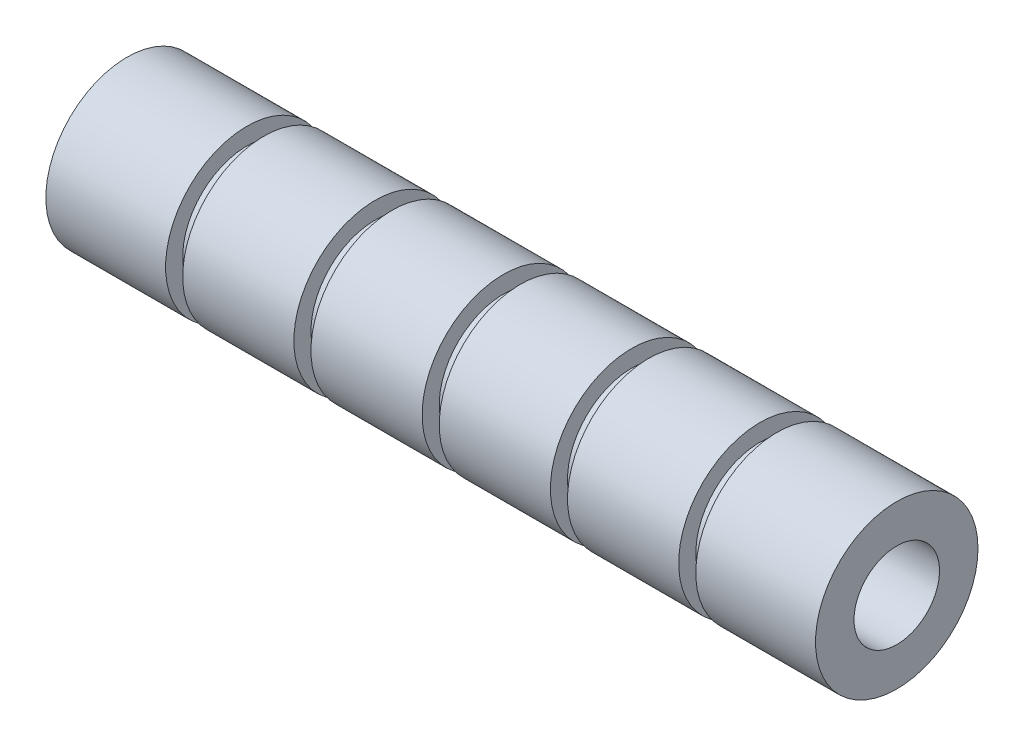
ISO-10303-21;
HEADER;
FILE_DESCRIPTION(('STEP AP214'),'2;1');
FILE_NAME('part.step','',(''),(''),'','','');
FILE_SCHEMA(('AUTOMOTIVE_DESIGN { 1 0 10303 214 1 1 1 1 }'));
ENDSEC;
DATA;
#1=APPLICATION_CONTEXT('core data for automotive mechanical design processes');
#2=APPLICATION_PROTOCOL_DEFINITION('international standard','automotive_design',2000,#1);
#3=PRODUCT_CONTEXT('',#1,'mechanical');
#4=PRODUCT('Part','Part','',(#3));
#5=PRODUCT_RELATED_PRODUCT_CATEGORY('part','',(#4));
#6=PRODUCT_DEFINITION_FORMATION('','',#4);
#7=PRODUCT_DEFINITION_CONTEXT('part definition',#1,'design');
#8=PRODUCT_DEFINITION('design','',#6,#7);
#9=PRODUCT_DEFINITION_SHAPE('','',#8);
#10=(LENGTH_UNIT() NAMED_UNIT(*) SI_UNIT(.MILLI.,.METRE.));
#11=(NAMED_UNIT(*) PLANE_ANGLE_UNIT() SI_UNIT($,.RADIAN.));
#12=(NAMED_UNIT(*) SI_UNIT($,.STERADIAN.) SOLID_ANGLE_UNIT());
#13=UNCERTAINTY_MEASURE_WITH_UNIT(LENGTH_MEASURE(1.E-05),#10,'distance_accuracy_value','');
#14=(GEOMETRIC_REPRESENTATION_CONTEXT(3) GLOBAL_UNCERTAINTY_ASSIGNED_CONTEXT((#13)) GLOBAL_UNIT_ASSIGNED_CONTEXT((#10,
#11,#12)) REPRESENTATION_CONTEXT('',''));
#15=CARTESIAN_POINT('',(0.,0.,0.));
#16=DIRECTION('',(0.,0.,1.));
#17=DIRECTION('',(1.,0.,0.));
#18=AXIS2_PLACEMENT_3D('',#15,#16,#17);
#19=CARTESIAN_POINT('',(0.999999999999998,0.,0.));
#20=DIRECTION('',(1.,0.,0.));
#21=DIRECTION('',(0.,0.,-1.));
#22=AXIS2_PLACEMENT_3D('',#19,#20,#21);
#23=CYLINDRICAL_SURFACE('',#22,7.5);
#24=CARTESIAN_POINT('',(-1.,0.,0.));
#25=DIRECTION('',(1.,0.,0.));
#26=DIRECTION('',(0.,0.,-1.));
#27=AXIS2_PLACEMENT_3D('',#24,#25,#26);
#28=CIRCLE('',#27,7.5);
#29=CARTESIAN_POINT('',(-1.,0.,-7.5));
#30=VERTEX_POINT('',#29);
#31=EDGE_CURVE('E131',#30,#30,#28,.T.);
#32=ORIENTED_EDGE('',*,*,#31,.T.);
#33=EDGE_LOOP('',(#32));
#34=FACE_BOUND('',#33,.T.);
#35=CARTESIAN_POINT('',(0.999999999999998,0.,0.));
#36=DIRECTION('',(1.,0.,0.));
#37=DIRECTION('',(0.,0.,-1.));
#38=AXIS2_PLACEMENT_3D('',#35,#36,#37);
#39=CIRCLE('',#38,7.5);
#40=CARTESIAN_POINT('',(0.999999999999998,0.,-7.5));
#41=VERTEX_POINT('',#40);
#42=EDGE_CURVE('E136',#41,#41,#39,.F.);
#43=ORIENTED_EDGE('',*,*,#42,.T.);
#44=EDGE_LOOP('',(#43));
#45=FACE_BOUND('',#44,.T.);
#46=ADVANCED_FACE('F15',(#34,#45),#23,.T.);
#47=CARTESIAN_POINT('',(0.999999999999998,0.,0.));
#48=DIRECTION('',(1.,0.,0.));
#49=DIRECTION('',(0.,0.,-1.));
#50=AXIS2_PLACEMENT_3D('',#47,#48,#49);
#51=PLANE('',#50);
#52=ORIENTED_EDGE('',*,*,#42,.F.);
#53=EDGE_LOOP('',(#52));
#54=FACE_BOUND('',#53,.T.);
#55=CARTESIAN_POINT('',(1.00000000000001,0.,0.));
#56=DIRECTION('',(1.,0.,0.));
#57=DIRECTION('',(0.,0.,-1.));
#58=AXIS2_PLACEMENT_3D('',#55,#56,#57);
#59=CIRCLE('',#58,9.5);
#60=CARTESIAN_POINT('',(1.00000000000001,0.,-9.49999999999999));
#61=VERTEX_POINT('',#60);
#62=EDGE_CURVE('E126',#61,#61,#59,.T.);
#63=ORIENTED_EDGE('',*,*,#62,.F.);
#64=EDGE_LOOP('',(#63));
#65=FACE_BOUND('',#64,.T.);
#66=ADVANCED_FACE('F142',(#54,#65),#51,.F.);
#67=CARTESIAN_POINT('',(-1.,0.,0.));
#68=DIRECTION('',(-1.,0.,0.));
#69=DIRECTION('',(0.,0.,1.));
#70=AXIS2_PLACEMENT_3D('',#67,#68,#69);
#71=PLANE('',#70);
#72=ORIENTED_EDGE('',*,*,#31,.F.);
#73=EDGE_LOOP('',(#72));
#74=FACE_BOUND('',#73,.T.);
#75=CARTESIAN_POINT('',(-0.999999999999994,0.,0.));
#76=DIRECTION('',(1.,0.,0.));
#77=DIRECTION('',(0.,0.,-1.));
#78=AXIS2_PLACEMENT_3D('',#75,#76,#77);
#79=CIRCLE('',#78,9.5);
#80=CARTESIAN_POINT('',(-0.999999999999994,0.,-9.49999999999999));
#81=VERTEX_POINT('',#80);
#82=EDGE_CURVE('E121',#81,#81,#79,.F.);
#83=ORIENTED_EDGE('',*,*,#82,.F.);
#84=EDGE_LOOP('',(#83));
#85=FACE_BOUND('',#84,.T.);
#86=ADVANCED_FACE('F145',(#74,#85),#71,.F.);
#87=CARTESIAN_POINT('',(-45.,0.,0.));
#88=DIRECTION('',(1.,0.,0.));
#89=DIRECTION('',(0.,0.,-1.));
#90=AXIS2_PLACEMENT_3D('',#87,#88,#89);
#91=CYLINDRICAL_SURFACE('',#90,9.5);
#92=ORIENTED_EDGE('',*,*,#62,.T.);
#93=EDGE_LOOP('',(#92));
#94=FACE_BOUND('',#93,.T.);
#95=CARTESIAN_POINT('',(14.,0.,0.));
#96=DIRECTION('',(1.,0.,0.));
#97=DIRECTION('',(0.,0.,-1.));
#98=AXIS2_PLACEMENT_3D('',#95,#96,#97);
#99=CIRCLE('',#98,9.5);
#100=CARTESIAN_POINT('',(14.,0.,-9.49999999999999));
#101=VERTEX_POINT('',#100);
#102=EDGE_CURVE('E116',#101,#101,#99,.F.);
#103=ORIENTED_EDGE('',*,*,#102,.T.);
#104=EDGE_LOOP('',(#103));
#105=FACE_BOUND('',#104,.T.);
#106=ADVANCED_FACE('F148',(#94,#105),#91,.T.);
#107=CARTESIAN_POINT('',(-45.,0.,0.));
#108=DIRECTION('',(1.,0.,0.));
#109=DIRECTION('',(0.,0.,-1.));
#110=AXIS2_PLACEMENT_3D('',#107,#108,#109);
#111=CYLINDRICAL_SURFACE('',#110,9.5);
#112=CARTESIAN_POINT('',(-14.,0.,0.));
#113=DIRECTION('',(1.,0.,0.));
#114=DIRECTION('',(0.,0.,-1.));
#115=AXIS2_PLACEMENT_3D('',#112,#113,#114);
#116=CIRCLE('',#115,9.5);
#117=CARTESIAN_POINT('',(-14.,0.,-9.49999999999999));
#118=VERTEX_POINT('',#117);
#119=EDGE_CURVE('E111',#118,#118,#116,.T.);
#120=ORIENTED_EDGE('',*,*,#119,.T.);
#121=EDGE_LOOP('',(#120));
#122=FACE_BOUND('',#121,.T.);
#123=ORIENTED_EDGE('',*,*,#82,.T.);
#124=EDGE_LOOP('',(#123));
#125=FACE_BOUND('',#124,.T.);
#126=ADVANCED_FACE('F151',(#122,#125),#111,.T.);
#127=CARTESIAN_POINT('',(14.,0.,0.));
#128=DIRECTION('',(-1.,0.,0.));
#129=DIRECTION('',(0.,0.,1.));
#130=AXIS2_PLACEMENT_3D('',#127,#128,#129);
#131=PLANE('',#130);
#132=CARTESIAN_POINT('',(14.,0.,0.));
#133=DIRECTION('',(1.,0.,0.));
#134=DIRECTION('',(0.,0.,-1.));
#135=AXIS2_PLACEMENT_3D('',#132,#133,#134);
#136=CIRCLE('',#135,7.5);
#137=CARTESIAN_POINT('',(14.,0.,-7.5));
#138=VERTEX_POINT('',#137);
#139=EDGE_CURVE('E106',#138,#138,#136,.T.);
#140=ORIENTED_EDGE('',*,*,#139,.F.);
#141=EDGE_LOOP('',(#140));
#142=FACE_BOUND('',#141,.T.);
#143=ORIENTED_EDGE('',*,*,#102,.F.);
#144=EDGE_LOOP('',(#143));
#145=FACE_BOUND('',#144,.T.);
#146=ADVANCED_FACE('F155',(#142,#145),#131,.F.);
#147=CARTESIAN_POINT('',(-14.,0.,0.));
#148=DIRECTION('',(1.,0.,0.));
#149=DIRECTION('',(0.,0.,-1.));
#150=AXIS2_PLACEMENT_3D('',#147,#148,#149);
#151=PLANE('',#150);
#152=CARTESIAN_POINT('',(-14.,0.,0.));
#153=DIRECTION('',(1.,0.,0.));
#154=DIRECTION('',(0.,0.,-1.));
#155=AXIS2_PLACEMENT_3D('',#152,#153,#154);
#156=CIRCLE('',#155,7.5);
#157=CARTESIAN_POINT('',(-14.,0.,-7.5));
#158=VERTEX_POINT('',#157);
#159=EDGE_CURVE('E101',#158,#158,#156,.F.);
#160=ORIENTED_EDGE('',*,*,#159,.F.);
#161=EDGE_LOOP('',(#160));
#162=FACE_BOUND('',#161,.T.);
#163=ORIENTED_EDGE('',*,*,#119,.F.);
#164=EDGE_LOOP('',(#163));
#165=FACE_BOUND('',#164,.T.);
#166=ADVANCED_FACE('F157',(#162,#165),#151,.F.);
#167=CARTESIAN_POINT('',(16.,0.,0.));
#168=DIRECTION('',(1.,0.,0.));
#169=DIRECTION('',(0.,0.,-1.));
#170=AXIS2_PLACEMENT_3D('',#167,#168,#169);
#171=CYLINDRICAL_SURFACE('',#170,7.5);
#172=ORIENTED_EDGE('',*,*,#139,.T.);
#173=EDGE_LOOP('',(#172));
#174=FACE_BOUND('',#173,.T.);
#175=CARTESIAN_POINT('',(16.,0.,0.));
#176=DIRECTION('',(1.,0.,0.));
#177=DIRECTION('',(0.,0.,-1.));
#178=AXIS2_PLACEMENT_3D('',#175,#176,#177);
#179=CIRCLE('',#178,7.5);
#180=CARTESIAN_POINT('',(16.,0.,-7.5));
#181=VERTEX_POINT('',#180);
#182=EDGE_CURVE('E96',#181,#181,#179,.F.);
#183=ORIENTED_EDGE('',*,*,#182,.T.);
#184=EDGE_LOOP('',(#183));
#185=FACE_BOUND('',#184,.T.);
#186=ADVANCED_FACE('F165',(#174,#185),#171,.T.);
#187=CARTESIAN_POINT('',(-14.,0.,0.));
#188=DIRECTION('',(1.,0.,0.));
#189=DIRECTION('',(0.,0.,-1.));
#190=AXIS2_PLACEMENT_3D('',#187,#188,#189);
#191=CYLINDRICAL_SURFACE('',#190,7.5);
#192=CARTESIAN_POINT('',(-16.,0.,0.));
#193=DIRECTION('',(1.,0.,0.));
#194=DIRECTION('',(0.,0.,-1.));
#195=AXIS2_PLACEMENT_3D('',#192,#193,#194);
#196=CIRCLE('',#195,7.5);
#197=CARTESIAN_POINT('',(-16.,0.,-7.5));
#198=VERTEX_POINT('',#197);
#199=EDGE_CURVE('E91',#198,#198,#196,.T.);
#200=ORIENTED_EDGE('',*,*,#199,.T.);
#201=EDGE_LOOP('',(#200));
#202=FACE_BOUND('',#201,.T.);
#203=ORIENTED_EDGE('',*,*,#159,.T.);
#204=EDGE_LOOP('',(#203));
#205=FACE_BOUND('',#204,.T.);
#206=ADVANCED_FACE('F233',(#202,#205),#191,.T.);
#207=CARTESIAN_POINT('',(16.,0.,0.));
#208=DIRECTION('',(1.,0.,0.));
#209=DIRECTION('',(0.,0.,-1.));
#210=AXIS2_PLACEMENT_3D('',#207,#208,#209);
#211=PLANE('',#210);
#212=ORIENTED_EDGE('',*,*,#182,.F.);
#213=EDGE_LOOP('',(#212));
#214=FACE_BOUND('',#213,.T.);
#215=CARTESIAN_POINT('',(16.,0.,0.));
#216=DIRECTION('',(1.,0.,0.));
#217=DIRECTION('',(0.,0.,-1.));
#218=AXIS2_PLACEMENT_3D('',#215,#216,#217);
#219=CIRCLE('',#218,9.5);
#220=CARTESIAN_POINT('',(16.,0.,-9.49999999999999));
#221=VERTEX_POINT('',#220);
#222=EDGE_CURVE('E86',#221,#221,#219,.T.);
#223=ORIENTED_EDGE('',*,*,#222,.F.);
#224=EDGE_LOOP('',(#223));
#225=FACE_BOUND('',#224,.T.);
#226=ADVANCED_FACE('F229',(#214,#225),#211,.F.);
#227=CARTESIAN_POINT('',(-16.,0.,0.));
#228=DIRECTION('',(-1.,0.,0.));
#229=DIRECTION('',(0.,0.,1.));
#230=AXIS2_PLACEMENT_3D('',#227,#228,#229);
#231=PLANE('',#230);
#232=ORIENTED_EDGE('',*,*,#199,.F.);
#233=EDGE_LOOP('',(#232));
#234=FACE_BOUND('',#233,.T.);
#235=CARTESIAN_POINT('',(-16.,0.,0.));
#236=DIRECTION('',(1.,0.,0.));
#237=DIRECTION('',(0.,0.,-1.));
#238=AXIS2_PLACEMENT_3D('',#235,#236,#237);
#239=CIRCLE('',#238,9.5);
#240=CARTESIAN_POINT('',(-16.,0.,-9.49999999999999));
#241=VERTEX_POINT('',#240);
#242=EDGE_CURVE('E81',#241,#241,#239,.F.);
#243=ORIENTED_EDGE('',*,*,#242,.F.);
#244=EDGE_LOOP('',(#243));
#245=FACE_BOUND('',#244,.T.);
#246=ADVANCED_FACE('F225',(#234,#245),#231,.F.);
#247=CARTESIAN_POINT('',(-45.,0.,0.));
#248=DIRECTION('',(1.,0.,0.));
#249=DIRECTION('',(0.,0.,-1.));
#250=AXIS2_PLACEMENT_3D('',#247,#248,#249);
#251=CYLINDRICAL_SURFACE('',#250,9.5);
#252=ORIENTED_EDGE('',*,*,#222,.T.);
#253=EDGE_LOOP('',(#252));
#254=FACE_BOUND('',#253,.T.);
#255=CARTESIAN_POINT('',(29.,0.,0.));
#256=DIRECTION('',(1.,0.,0.));
#257=DIRECTION('',(0.,0.,-1.));
#258=AXIS2_PLACEMENT_3D('',#255,#256,#257);
#259=CIRCLE('',#258,9.5);
#260=CARTESIAN_POINT('',(29.,0.,-9.49999999999999));
#261=VERTEX_POINT('',#260);
#262=EDGE_CURVE('E76',#261,#261,#259,.F.);
#263=ORIENTED_EDGE('',*,*,#262,.T.);
#264=EDGE_LOOP('',(#263));
#265=FACE_BOUND('',#264,.T.);
#266=ADVANCED_FACE('F221',(#254,#265),#251,.T.);
#267=CARTESIAN_POINT('',(-45.,0.,0.));
#268=DIRECTION('',(1.,0.,0.));
#269=DIRECTION('',(0.,0.,-1.));
#270=AXIS2_PLACEMENT_3D('',#267,#268,#269);
#271=CYLINDRICAL_SURFACE('',#270,9.5);
#272=CARTESIAN_POINT('',(-29.,0.,0.));
#273=DIRECTION('',(1.,0.,0.));
#274=DIRECTION('',(0.,0.,-1.));
#275=AXIS2_PLACEMENT_3D('',#272,#273,#274);
#276=CIRCLE('',#275,9.5);
#277=CARTESIAN_POINT('',(-29.,0.,-9.49999999999999));
#278=VERTEX_POINT('',#277);
#279=EDGE_CURVE('E71',#278,#278,#276,.T.);
#280=ORIENTED_EDGE('',*,*,#279,.T.);
#281=EDGE_LOOP('',(#280));
#282=FACE_BOUND('',#281,.T.);
#283=ORIENTED_EDGE('',*,*,#242,.T.);
#284=EDGE_LOOP('',(#283));
#285=FACE_BOUND('',#284,.T.);
#286=ADVANCED_FACE('F217',(#282,#285),#271,.T.);
#287=CARTESIAN_POINT('',(29.,0.,0.));
#288=DIRECTION('',(-1.,0.,0.));
#289=DIRECTION('',(0.,0.,1.));
#290=AXIS2_PLACEMENT_3D('',#287,#288,#289);
#291=PLANE('',#290);
#292=CARTESIAN_POINT('',(29.,0.,0.));
#293=DIRECTION('',(1.,0.,0.));
#294=DIRECTION('',(0.,0.,-1.));
#295=AXIS2_PLACEMENT_3D('',#292,#293,#294);
#296=CIRCLE('',#295,7.5);
#297=CARTESIAN_POINT('',(29.,0.,-7.5));
#298=VERTEX_POINT('',#297);
#299=EDGE_CURVE('E66',#298,#298,#296,.T.);
#300=ORIENTED_EDGE('',*,*,#299,.F.);
#301=EDGE_LOOP('',(#300));
#302=FACE_BOUND('',#301,.T.);
#303=ORIENTED_EDGE('',*,*,#262,.F.);
#304=EDGE_LOOP('',(#303));
#305=FACE_BOUND('',#304,.T.);
#306=ADVANCED_FACE('F213',(#302,#305),#291,.F.);
#307=CARTESIAN_POINT('',(-29.,0.,0.));
#308=DIRECTION('',(1.,0.,0.));
#309=DIRECTION('',(0.,0.,-1.));
#310=AXIS2_PLACEMENT_3D('',#307,#308,#309);
#311=PLANE('',#310);
#312=CARTESIAN_POINT('',(-29.,0.,0.));
#313=DIRECTION('',(1.,0.,0.));
#314=DIRECTION('',(0.,0.,-1.));
#315=AXIS2_PLACEMENT_3D('',#312,#313,#314);
#316=CIRCLE('',#315,7.5);
#317=CARTESIAN_POINT('',(-29.,0.,-7.5));
#318=VERTEX_POINT('',#317);
#319=EDGE_CURVE('E61',#318,#318,#316,.F.);
#320=ORIENTED_EDGE('',*,*,#319,.F.);
#321=EDGE_LOOP('',(#320));
#322=FACE_BOUND('',#321,.T.);
#323=ORIENTED_EDGE('',*,*,#279,.F.);
#324=EDGE_LOOP('',(#323));
#325=FACE_BOUND('',#324,.T.);
#326=ADVANCED_FACE('F209',(#322,#325),#311,.F.);
#327=CARTESIAN_POINT('',(31.,0.,0.));
#328=DIRECTION('',(1.,0.,0.));
#329=DIRECTION('',(0.,0.,-1.));
#330=AXIS2_PLACEMENT_3D('',#327,#328,#329);
#331=CYLINDRICAL_SURFACE('',#330,7.5);
#332=ORIENTED_EDGE('',*,*,#299,.T.);
#333=EDGE_LOOP('',(#332));
#334=FACE_BOUND('',#333,.T.);
#335=CARTESIAN_POINT('',(31.,0.,0.));
#336=DIRECTION('',(1.,0.,0.));
#337=DIRECTION('',(0.,0.,-1.));
#338=AXIS2_PLACEMENT_3D('',#335,#336,#337);
#339=CIRCLE('',#338,7.5);
#340=CARTESIAN_POINT('',(31.,0.,-7.5));
#341=VERTEX_POINT('',#340);
#342=EDGE_CURVE('E56',#341,#341,#339,.F.);
#343=ORIENTED_EDGE('',*,*,#342,.T.);
#344=EDGE_LOOP('',(#343));
#345=FACE_BOUND('',#344,.T.);
#346=ADVANCED_FACE('F205',(#334,#345),#331,.T.);
#347=CARTESIAN_POINT('',(-29.,0.,0.));
#348=DIRECTION('',(1.,0.,0.));
#349=DIRECTION('',(0.,0.,-1.));
#350=AXIS2_PLACEMENT_3D('',#347,#348,#349);
#351=CYLINDRICAL_SURFACE('',#350,7.5);
#352=CARTESIAN_POINT('',(-31.,0.,0.));
#353=DIRECTION('',(1.,0.,0.));
#354=DIRECTION('',(0.,0.,-1.));
#355=AXIS2_PLACEMENT_3D('',#352,#353,#354);
#356=CIRCLE('',#355,7.5);
#357=CARTESIAN_POINT('',(-31.,0.,-7.5));
#358=VERTEX_POINT('',#357);
#359=EDGE_CURVE('E51',#358,#358,#356,.T.);
#360=ORIENTED_EDGE('',*,*,#359,.T.);
#361=EDGE_LOOP('',(#360));
#362=FACE_BOUND('',#361,.T.);
#363=ORIENTED_EDGE('',*,*,#319,.T.);
#364=EDGE_LOOP('',(#363));
#365=FACE_BOUND('',#364,.T.);
#366=ADVANCED_FACE('F201',(#362,#365),#351,.T.);
#367=CARTESIAN_POINT('',(31.,0.,0.));
#368=DIRECTION('',(1.,0.,0.));
#369=DIRECTION('',(0.,0.,-1.));
#370=AXIS2_PLACEMENT_3D('',#367,#368,#369);
#371=PLANE('',#370);
#372=ORIENTED_EDGE('',*,*,#342,.F.);
#373=EDGE_LOOP('',(#372));
#374=FACE_BOUND('',#373,.T.);
#375=CARTESIAN_POINT('',(31.,0.,0.));
#376=DIRECTION('',(1.,0.,0.));
#377=DIRECTION('',(0.,0.,-1.));
#378=AXIS2_PLACEMENT_3D('',#375,#376,#377);
#379=CIRCLE('',#378,9.5);
#380=CARTESIAN_POINT('',(31.,0.,-9.49999999999999));
#381=VERTEX_POINT('',#380);
#382=EDGE_CURVE('E46',#381,#381,#379,.T.);
#383=ORIENTED_EDGE('',*,*,#382,.F.);
#384=EDGE_LOOP('',(#383));
#385=FACE_BOUND('',#384,.T.);
#386=ADVANCED_FACE('F197',(#374,#385),#371,.F.);
#387=CARTESIAN_POINT('',(-31.,0.,0.));
#388=DIRECTION('',(-1.,0.,0.));
#389=DIRECTION('',(0.,0.,1.));
#390=AXIS2_PLACEMENT_3D('',#387,#388,#389);
#391=PLANE('',#390);
#392=ORIENTED_EDGE('',*,*,#359,.F.);
#393=EDGE_LOOP('',(#392));
#394=FACE_BOUND('',#393,.T.);
#395=CARTESIAN_POINT('',(-31.,0.,0.));
#396=DIRECTION('',(1.,0.,0.));
#397=DIRECTION('',(0.,0.,-1.));
#398=AXIS2_PLACEMENT_3D('',#395,#396,#397);
#399=CIRCLE('',#398,9.5);
#400=CARTESIAN_POINT('',(-31.,0.,-9.49999999999999));
#401=VERTEX_POINT('',#400);
#402=EDGE_CURVE('E41',#401,#401,#399,.F.);
#403=ORIENTED_EDGE('',*,*,#402,.F.);
#404=EDGE_LOOP('',(#403));
#405=FACE_BOUND('',#404,.T.);
#406=ADVANCED_FACE('F193',(#394,#405),#391,.F.);
#407=CARTESIAN_POINT('',(-45.,0.,0.));
#408=DIRECTION('',(1.,0.,0.));
#409=DIRECTION('',(0.,0.,-1.));
#410=AXIS2_PLACEMENT_3D('',#407,#408,#409);
#411=CYLINDRICAL_SURFACE('',#410,9.5);
#412=ORIENTED_EDGE('',*,*,#382,.T.);
#413=EDGE_LOOP('',(#412));
#414=FACE_BOUND('',#413,.T.);
#415=CARTESIAN_POINT('',(45.,0.,0.));
#416=DIRECTION('',(1.,0.,0.));
#417=DIRECTION('',(0.,0.,-1.));
#418=AXIS2_PLACEMENT_3D('',#415,#416,#417);
#419=CIRCLE('',#418,9.5);
#420=CARTESIAN_POINT('',(45.,0.,-9.49999999999999));
#421=VERTEX_POINT('',#420);
#422=EDGE_CURVE('E36',#421,#421,#419,.T.);
#423=ORIENTED_EDGE('',*,*,#422,.F.);
#424=EDGE_LOOP('',(#423));
#425=FACE_BOUND('',#424,.T.);
#426=ADVANCED_FACE('F189',(#414,#425),#411,.T.);
#427=CARTESIAN_POINT('',(-45.,0.,0.));
#428=DIRECTION('',(1.,0.,0.));
#429=DIRECTION('',(0.,0.,-1.));
#430=AXIS2_PLACEMENT_3D('',#427,#428,#429);
#431=CYLINDRICAL_SURFACE('',#430,9.5);
#432=CARTESIAN_POINT('',(-45.,0.,0.));
#433=DIRECTION('',(1.,0.,0.));
#434=DIRECTION('',(0.,0.,-1.));
#435=AXIS2_PLACEMENT_3D('',#432,#433,#434);
#436=CIRCLE('',#435,9.5);
#437=CARTESIAN_POINT('',(-45.,0.,-9.49999999999999));
#438=VERTEX_POINT('',#437);
#439=EDGE_CURVE('E27',#438,#438,#436,.T.);
#440=ORIENTED_EDGE('',*,*,#439,.T.);
#441=EDGE_LOOP('',(#440));
#442=FACE_BOUND('',#441,.T.);
#443=ORIENTED_EDGE('',*,*,#402,.T.);
#444=EDGE_LOOP('',(#443));
#445=FACE_BOUND('',#444,.T.);
#446=ADVANCED_FACE('F185',(#442,#445),#431,.T.);
#447=CARTESIAN_POINT('',(45.,0.,0.));
#448=DIRECTION('',(1.,0.,0.));
#449=DIRECTION('',(0.,0.,-1.));
#450=AXIS2_PLACEMENT_3D('',#447,#448,#449);
#451=PLANE('',#450);
#452=CARTESIAN_POINT('',(45.,0.,0.));
#453=DIRECTION('',(-1.,0.,0.));
#454=DIRECTION('',(0.,0.,1.));
#455=AXIS2_PLACEMENT_3D('',#452,#453,#454);
#456=CIRCLE('',#455,5.);
#457=CARTESIAN_POINT('',(45.,0.,4.99999999999999));
#458=VERTEX_POINT('',#457);
#459=EDGE_CURVE('E22',#458,#458,#456,.T.);
#460=ORIENTED_EDGE('',*,*,#459,.T.);
#461=EDGE_LOOP('',(#460));
#462=FACE_BOUND('',#461,.T.);
#463=ORIENTED_EDGE('',*,*,#422,.T.);
#464=EDGE_LOOP('',(#463));
#465=FACE_BOUND('',#464,.T.);
#466=ADVANCED_FACE('F179',(#462,#465),#451,.T.);
#467=CARTESIAN_POINT('',(-45.,0.,0.));
#468=DIRECTION('',(1.,0.,0.));
#469=DIRECTION('',(0.,0.,-1.));
#470=AXIS2_PLACEMENT_3D('',#467,#468,#469);
#471=PLANE('',#470);
#472=CARTESIAN_POINT('',(-45.,0.,0.));
#473=DIRECTION('',(-1.,0.,0.));
#474=DIRECTION('',(0.,0.,1.));
#475=AXIS2_PLACEMENT_3D('',#472,#473,#474);
#476=CIRCLE('',#475,5.);
#477=CARTESIAN_POINT('',(-45.,0.,5.00000000000001));
#478=VERTEX_POINT('',#477);
#479=EDGE_CURVE('E10',#478,#478,#476,.F.);
#480=ORIENTED_EDGE('',*,*,#479,.T.);
#481=EDGE_LOOP('',(#480));
#482=FACE_BOUND('',#481,.T.);
#483=ORIENTED_EDGE('',*,*,#439,.F.);
#484=EDGE_LOOP('',(#483));
#485=FACE_BOUND('',#484,.T.);
#486=ADVANCED_FACE('F173',(#482,#485),#471,.F.);
#487=CARTESIAN_POINT('',(-45.,0.,0.));
#488=DIRECTION('',(-1.,0.,0.));
#489=DIRECTION('',(0.,0.,1.));
#490=AXIS2_PLACEMENT_3D('',#487,#488,#489);
#491=CYLINDRICAL_SURFACE('',#490,5.);
#492=ORIENTED_EDGE('',*,*,#479,.F.);
#493=EDGE_LOOP('',(#492));
#494=FACE_BOUND('',#493,.T.);
#495=ORIENTED_EDGE('',*,*,#459,.F.);
#496=EDGE_LOOP('',(#495));
#497=FACE_BOUND('',#496,.T.);
#498=ADVANCED_FACE('F171',(#494,#497),#491,.F.);
#499=CLOSED_SHELL('',(#46,#66,#86,#106,#126,#146,#166,#186,#206,#226,#246,#266,#286,#306,#326,
#346,#366,#386,#406,#426,#446,#466,#486,#498));
#500=MANIFOLD_SOLID_BREP('B1',#499);
#501=ADVANCED_BREP_SHAPE_REPRESENTATION('',(#18,#500),#14);
#502=SHAPE_DEFINITION_REPRESENTATION(#9,#501);
ENDSEC;
END-ISO-10303-21;
